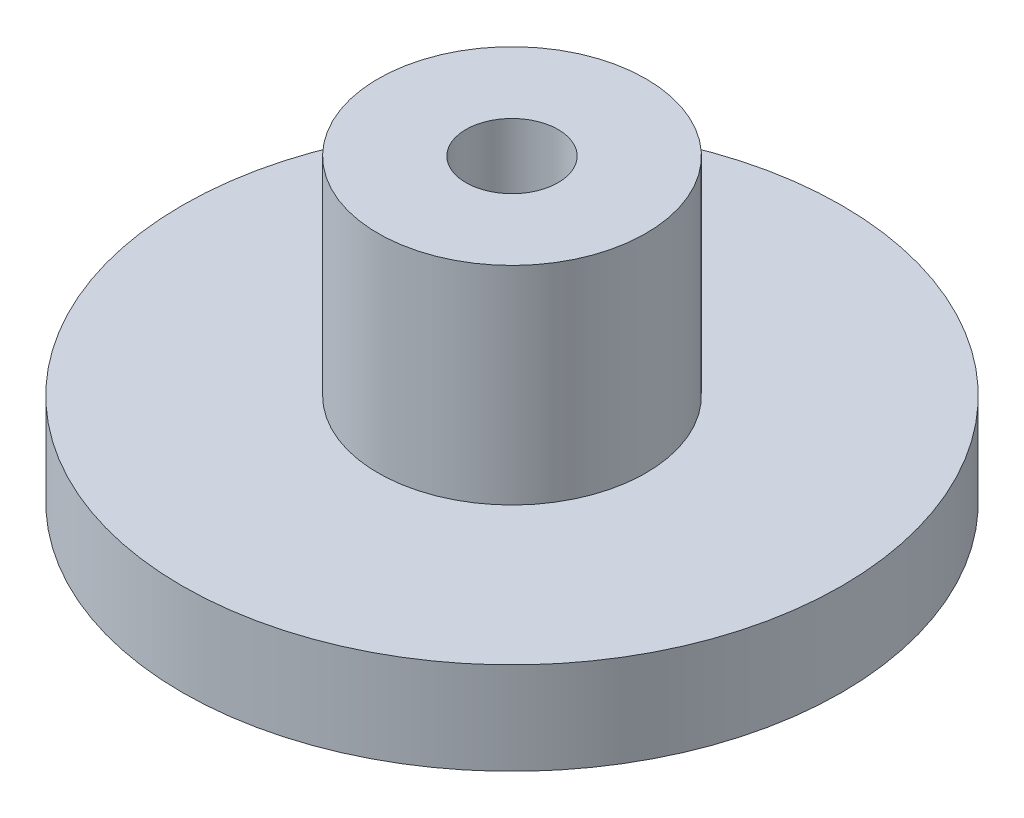
ISO-10303-21;
HEADER;
FILE_DESCRIPTION(('STEP AP214'),'2;1');
FILE_NAME('part.step','',(''),(''),'','','');
FILE_SCHEMA(('AUTOMOTIVE_DESIGN { 1 0 10303 214 1 1 1 1 }'));
ENDSEC;
DATA;
#1=APPLICATION_CONTEXT('core data for automotive mechanical design processes');
#2=APPLICATION_PROTOCOL_DEFINITION('international standard','automotive_design',2000,#1);
#3=PRODUCT_CONTEXT('',#1,'mechanical');
#4=PRODUCT('Part','Part','',(#3));
#5=PRODUCT_RELATED_PRODUCT_CATEGORY('part','',(#4));
#6=PRODUCT_DEFINITION_FORMATION('','',#4);
#7=PRODUCT_DEFINITION_CONTEXT('part definition',#1,'design');
#8=PRODUCT_DEFINITION('design','',#6,#7);
#9=PRODUCT_DEFINITION_SHAPE('','',#8);
#10=(LENGTH_UNIT() NAMED_UNIT(*) SI_UNIT(.MILLI.,.METRE.));
#11=(NAMED_UNIT(*) PLANE_ANGLE_UNIT() SI_UNIT($,.RADIAN.));
#12=(NAMED_UNIT(*) SI_UNIT($,.STERADIAN.) SOLID_ANGLE_UNIT());
#13=UNCERTAINTY_MEASURE_WITH_UNIT(LENGTH_MEASURE(1.E-05),#10,'distance_accuracy_value','');
#14=(GEOMETRIC_REPRESENTATION_CONTEXT(3) GLOBAL_UNCERTAINTY_ASSIGNED_CONTEXT((#13)) GLOBAL_UNIT_ASSIGNED_CONTEXT((#10,
#11,#12)) REPRESENTATION_CONTEXT('',''));
#15=CARTESIAN_POINT('',(0.,0.,0.));
#16=DIRECTION('',(0.,0.,1.));
#17=DIRECTION('',(1.,0.,0.));
#18=AXIS2_PLACEMENT_3D('',#15,#16,#17);
#19=CARTESIAN_POINT('',(2.905125,6.5,0.));
#20=DIRECTION('',(0.,1.,0.));
#21=DIRECTION('',(0.,0.,1.));
#22=AXIS2_PLACEMENT_3D('',#19,#20,#21);
#23=PLANE('',#22);
#24=CARTESIAN_POINT('',(0.,6.5,0.));
#25=DIRECTION('',(0.,-1.,0.));
#26=DIRECTION('',(0.,0.,-1.));
#27=AXIS2_PLACEMENT_3D('',#24,#25,#26);
#28=CIRCLE('',#27,1.);
#29=CARTESIAN_POINT('',(0.,6.5,-1.));
#30=VERTEX_POINT('',#29);
#31=EDGE_CURVE('E10',#30,#30,#28,.T.);
#32=ORIENTED_EDGE('',*,*,#31,.T.);
#33=EDGE_LOOP('',(#32));
#34=FACE_BOUND('',#33,.T.);
#35=CARTESIAN_POINT('',(0.,6.5,0.));
#36=DIRECTION('',(0.,-1.,0.));
#37=DIRECTION('',(0.,0.,-1.));
#38=AXIS2_PLACEMENT_3D('',#35,#36,#37);
#39=CIRCLE('',#38,2.905125);
#40=CARTESIAN_POINT('',(0.,6.5,-2.905125));
#41=VERTEX_POINT('',#40);
#42=EDGE_CURVE('E66',#41,#41,#39,.T.);
#43=ORIENTED_EDGE('',*,*,#42,.F.);
#44=EDGE_LOOP('',(#43));
#45=FACE_BOUND('',#44,.T.);
#46=ADVANCED_FACE('F32',(#34,#45),#23,.T.);
#47=CARTESIAN_POINT('',(0.,0.,0.));
#48=DIRECTION('',(0.,-1.,0.));
#49=DIRECTION('',(0.,0.,-1.));
#50=AXIS2_PLACEMENT_3D('',#47,#48,#49);
#51=CYLINDRICAL_SURFACE('',#50,1.);
#52=CARTESIAN_POINT('',(0.,0.,0.));
#53=DIRECTION('',(0.,-1.,0.));
#54=DIRECTION('',(0.,0.,-1.));
#55=AXIS2_PLACEMENT_3D('',#52,#53,#54);
#56=CIRCLE('',#55,1.);
#57=CARTESIAN_POINT('',(0.,0.,-1.));
#58=VERTEX_POINT('',#57);
#59=EDGE_CURVE('E38',#58,#58,#56,.T.);
#60=ORIENTED_EDGE('',*,*,#59,.T.);
#61=EDGE_LOOP('',(#60));
#62=FACE_BOUND('',#61,.T.);
#63=ORIENTED_EDGE('',*,*,#31,.F.);
#64=EDGE_LOOP('',(#63));
#65=FACE_BOUND('',#64,.T.);
#66=ADVANCED_FACE('F74',(#62,#65),#51,.F.);
#67=CARTESIAN_POINT('',(1.,0.,0.));
#68=DIRECTION('',(0.,-1.,0.));
#69=DIRECTION('',(0.,0.,-1.));
#70=AXIS2_PLACEMENT_3D('',#67,#68,#69);
#71=PLANE('',#70);
#72=CARTESIAN_POINT('',(0.,0.,0.));
#73=DIRECTION('',(0.,-1.,0.));
#74=DIRECTION('',(0.,0.,-1.));
#75=AXIS2_PLACEMENT_3D('',#72,#73,#74);
#76=CIRCLE('',#75,2.5);
#77=CARTESIAN_POINT('',(0.,0.,-2.5));
#78=VERTEX_POINT('',#77);
#79=EDGE_CURVE('E42',#78,#78,#76,.T.);
#80=ORIENTED_EDGE('',*,*,#79,.T.);
#81=EDGE_LOOP('',(#80));
#82=FACE_BOUND('',#81,.T.);
#83=ORIENTED_EDGE('',*,*,#59,.F.);
#84=EDGE_LOOP('',(#83));
#85=FACE_BOUND('',#84,.T.);
#86=ADVANCED_FACE('F78',(#82,#85),#71,.T.);
#87=CARTESIAN_POINT('',(0.,0.,0.));
#88=DIRECTION('',(0.,-1.,0.));
#89=DIRECTION('',(0.,0.,-1.));
#90=AXIS2_PLACEMENT_3D('',#87,#88,#89);
#91=CYLINDRICAL_SURFACE('',#90,2.5);
#92=CARTESIAN_POINT('',(0.,0.6,0.));
#93=DIRECTION('',(0.,-1.,0.));
#94=DIRECTION('',(0.,0.,-1.));
#95=AXIS2_PLACEMENT_3D('',#92,#93,#94);
#96=CIRCLE('',#95,2.5);
#97=CARTESIAN_POINT('',(0.,0.6,-2.5));
#98=VERTEX_POINT('',#97);
#99=EDGE_CURVE('E46',#98,#98,#96,.T.);
#100=ORIENTED_EDGE('',*,*,#99,.T.);
#101=EDGE_LOOP('',(#100));
#102=FACE_BOUND('',#101,.T.);
#103=ORIENTED_EDGE('',*,*,#79,.F.);
#104=EDGE_LOOP('',(#103));
#105=FACE_BOUND('',#104,.T.);
#106=ADVANCED_FACE('F82',(#102,#105),#91,.T.);
#107=CARTESIAN_POINT('',(2.5,0.6,0.));
#108=DIRECTION('',(0.,-1.,0.));
#109=DIRECTION('',(0.,0.,-1.));
#110=AXIS2_PLACEMENT_3D('',#107,#108,#109);
#111=PLANE('',#110);
#112=CARTESIAN_POINT('',(0.,0.6,0.));
#113=DIRECTION('',(0.,-1.,0.));
#114=DIRECTION('',(0.,0.,-1.));
#115=AXIS2_PLACEMENT_3D('',#112,#113,#114);
#116=CIRCLE('',#115,5.5);
#117=CARTESIAN_POINT('',(0.,0.6,-5.5));
#118=VERTEX_POINT('',#117);
#119=EDGE_CURVE('E51',#118,#118,#116,.T.);
#120=ORIENTED_EDGE('',*,*,#119,.T.);
#121=EDGE_LOOP('',(#120));
#122=FACE_BOUND('',#121,.T.);
#123=ORIENTED_EDGE('',*,*,#99,.F.);
#124=EDGE_LOOP('',(#123));
#125=FACE_BOUND('',#124,.T.);
#126=ADVANCED_FACE('F89',(#122,#125),#111,.T.);
#127=CARTESIAN_POINT('',(0.,0.,0.));
#128=DIRECTION('',(0.,-1.,0.));
#129=DIRECTION('',(0.,0.,-1.));
#130=AXIS2_PLACEMENT_3D('',#127,#128,#129);
#131=CYLINDRICAL_SURFACE('',#130,5.5);
#132=CARTESIAN_POINT('',(0.,0.,0.));
#133=DIRECTION('',(0.,-1.,0.));
#134=DIRECTION('',(0.,0.,-1.));
#135=AXIS2_PLACEMENT_3D('',#132,#133,#134);
#136=CIRCLE('',#135,5.5);
#137=CARTESIAN_POINT('',(0.,0.,-5.5));
#138=VERTEX_POINT('',#137);
#139=EDGE_CURVE('E54',#138,#138,#136,.T.);
#140=ORIENTED_EDGE('',*,*,#139,.T.);
#141=EDGE_LOOP('',(#140));
#142=FACE_BOUND('',#141,.T.);
#143=ORIENTED_EDGE('',*,*,#119,.F.);
#144=EDGE_LOOP('',(#143));
#145=FACE_BOUND('',#144,.T.);
#146=ADVANCED_FACE('F93',(#142,#145),#131,.F.);
#147=CARTESIAN_POINT('',(5.5,0.,0.));
#148=DIRECTION('',(0.,-1.,0.));
#149=DIRECTION('',(0.,0.,-1.));
#150=AXIS2_PLACEMENT_3D('',#147,#148,#149);
#151=PLANE('',#150);
#152=CARTESIAN_POINT('',(0.,0.,0.));
#153=DIRECTION('',(0.,-1.,0.));
#154=DIRECTION('',(0.,0.,-1.));
#155=AXIS2_PLACEMENT_3D('',#152,#153,#154);
#156=CIRCLE('',#155,7.1501);
#157=CARTESIAN_POINT('',(0.,0.,-7.1501));
#158=VERTEX_POINT('',#157);
#159=EDGE_CURVE('E57',#158,#158,#156,.T.);
#160=ORIENTED_EDGE('',*,*,#159,.T.);
#161=EDGE_LOOP('',(#160));
#162=FACE_BOUND('',#161,.T.);
#163=ORIENTED_EDGE('',*,*,#139,.F.);
#164=EDGE_LOOP('',(#163));
#165=FACE_BOUND('',#164,.T.);
#166=ADVANCED_FACE('F97',(#162,#165),#151,.T.);
#167=CARTESIAN_POINT('',(0.,0.,0.));
#168=DIRECTION('',(0.,-1.,0.));
#169=DIRECTION('',(0.,0.,-1.));
#170=AXIS2_PLACEMENT_3D('',#167,#168,#169);
#171=CYLINDRICAL_SURFACE('',#170,7.1501);
#172=CARTESIAN_POINT('',(0.,2.,0.));
#173=DIRECTION('',(0.,-1.,0.));
#174=DIRECTION('',(0.,0.,-1.));
#175=AXIS2_PLACEMENT_3D('',#172,#173,#174);
#176=CIRCLE('',#175,7.1501);
#177=CARTESIAN_POINT('',(0.,2.,-7.1501));
#178=VERTEX_POINT('',#177);
#179=EDGE_CURVE('E60',#178,#178,#176,.T.);
#180=ORIENTED_EDGE('',*,*,#179,.T.);
#181=EDGE_LOOP('',(#180));
#182=FACE_BOUND('',#181,.T.);
#183=ORIENTED_EDGE('',*,*,#159,.F.);
#184=EDGE_LOOP('',(#183));
#185=FACE_BOUND('',#184,.T.);
#186=ADVANCED_FACE('F101',(#182,#185),#171,.T.);
#187=CARTESIAN_POINT('',(7.1501,2.,0.));
#188=DIRECTION('',(0.,1.,0.));
#189=DIRECTION('',(0.,0.,1.));
#190=AXIS2_PLACEMENT_3D('',#187,#188,#189);
#191=PLANE('',#190);
#192=CARTESIAN_POINT('',(0.,2.,0.));
#193=DIRECTION('',(0.,-1.,0.));
#194=DIRECTION('',(0.,0.,-1.));
#195=AXIS2_PLACEMENT_3D('',#192,#193,#194);
#196=CIRCLE('',#195,2.905125);
#197=CARTESIAN_POINT('',(0.,2.,-2.905125));
#198=VERTEX_POINT('',#197);
#199=EDGE_CURVE('E63',#198,#198,#196,.T.);
#200=ORIENTED_EDGE('',*,*,#199,.T.);
#201=EDGE_LOOP('',(#200));
#202=FACE_BOUND('',#201,.T.);
#203=ORIENTED_EDGE('',*,*,#179,.F.);
#204=EDGE_LOOP('',(#203));
#205=FACE_BOUND('',#204,.T.);
#206=ADVANCED_FACE('F105',(#202,#205),#191,.T.);
#207=CARTESIAN_POINT('',(0.,0.,0.));
#208=DIRECTION('',(0.,-1.,0.));
#209=DIRECTION('',(0.,0.,-1.));
#210=AXIS2_PLACEMENT_3D('',#207,#208,#209);
#211=CYLINDRICAL_SURFACE('',#210,2.905125);
#212=ORIENTED_EDGE('',*,*,#42,.T.);
#213=EDGE_LOOP('',(#212));
#214=FACE_BOUND('',#213,.T.);
#215=ORIENTED_EDGE('',*,*,#199,.F.);
#216=EDGE_LOOP('',(#215));
#217=FACE_BOUND('',#216,.T.);
#218=ADVANCED_FACE('F70',(#214,#217),#211,.T.);
#219=CLOSED_SHELL('',(#46,#66,#86,#106,#126,#146,#166,#186,#206,#218));
#220=MANIFOLD_SOLID_BREP('B2',#219);
#221=ADVANCED_BREP_SHAPE_REPRESENTATION('',(#18,#220),#14);
#222=SHAPE_DEFINITION_REPRESENTATION(#9,#221);
ENDSEC;
END-ISO-10303-21;
